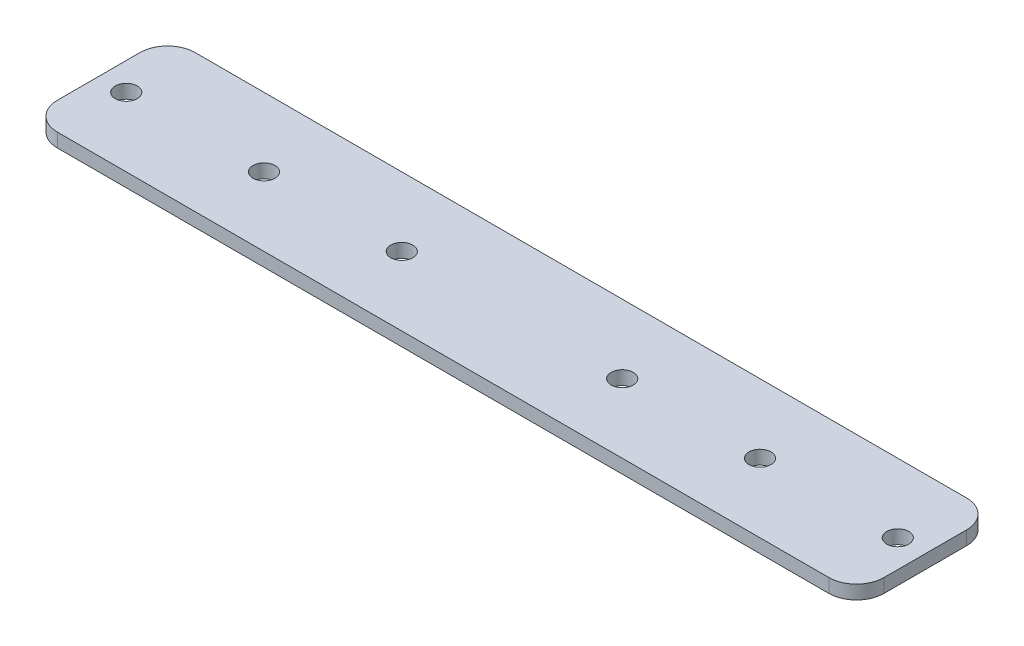
ISO-10303-21;
HEADER;
FILE_DESCRIPTION(('STEP AP214'),'2;1');
FILE_NAME('part.step','',(''),(''),'','','');
FILE_SCHEMA(('AUTOMOTIVE_DESIGN { 1 0 10303 214 1 1 1 1 }'));
ENDSEC;
DATA;
#1=APPLICATION_CONTEXT('core data for automotive mechanical design processes');
#2=APPLICATION_PROTOCOL_DEFINITION('international standard','automotive_design',2000,#1);
#3=PRODUCT_CONTEXT('',#1,'mechanical');
#4=PRODUCT('Part','Part','',(#3));
#5=PRODUCT_RELATED_PRODUCT_CATEGORY('part','',(#4));
#6=PRODUCT_DEFINITION_FORMATION('','',#4);
#7=PRODUCT_DEFINITION_CONTEXT('part definition',#1,'design');
#8=PRODUCT_DEFINITION('design','',#6,#7);
#9=PRODUCT_DEFINITION_SHAPE('','',#8);
#10=(LENGTH_UNIT() NAMED_UNIT(*) SI_UNIT(.MILLI.,.METRE.));
#11=(NAMED_UNIT(*) PLANE_ANGLE_UNIT() SI_UNIT($,.RADIAN.));
#12=(NAMED_UNIT(*) SI_UNIT($,.STERADIAN.) SOLID_ANGLE_UNIT());
#13=UNCERTAINTY_MEASURE_WITH_UNIT(LENGTH_MEASURE(1.E-05),#10,'distance_accuracy_value','');
#14=(GEOMETRIC_REPRESENTATION_CONTEXT(3) GLOBAL_UNCERTAINTY_ASSIGNED_CONTEXT((#13)) GLOBAL_UNIT_ASSIGNED_CONTEXT((#10,
#11,#12)) REPRESENTATION_CONTEXT('',''));
#15=CARTESIAN_POINT('',(0.,0.,0.));
#16=DIRECTION('',(0.,0.,1.));
#17=DIRECTION('',(1.,0.,0.));
#18=AXIS2_PLACEMENT_3D('',#15,#16,#17);
#19=CARTESIAN_POINT('',(0.,2.,0.));
#20=DIRECTION('',(0.,-1.,0.));
#21=DIRECTION('',(0.,0.,-1.));
#22=AXIS2_PLACEMENT_3D('',#19,#20,#21);
#23=PLANE('',#22);
#24=DIRECTION('',(-1.,0.,0.));
#25=VECTOR('',#24,1.);
#26=CARTESIAN_POINT('',(-60.,2.,-10.));
#27=LINE('',#26,#25);
#28=CARTESIAN_POINT('',(56.,2.,-10.));
#29=VERTEX_POINT('',#28);
#30=CARTESIAN_POINT('',(-56.,2.,-10.));
#31=VERTEX_POINT('',#30);
#32=EDGE_CURVE('E172',#29,#31,#27,.T.);
#33=ORIENTED_EDGE('',*,*,#32,.T.);
#34=CARTESIAN_POINT('',(-56.,2.,-6.));
#35=DIRECTION('',(0.,-1.,0.));
#36=DIRECTION('',(0.,0.,-1.));
#37=AXIS2_PLACEMENT_3D('',#34,#35,#36);
#38=CIRCLE('',#37,4.);
#39=CARTESIAN_POINT('',(-60.,2.,-6.));
#40=VERTEX_POINT('',#39);
#41=EDGE_CURVE('E153',#31,#40,#38,.F.);
#42=ORIENTED_EDGE('',*,*,#41,.T.);
#43=DIRECTION('',(0.,0.,1.));
#44=VECTOR('',#43,1.);
#45=CARTESIAN_POINT('',(-60.,2.,10.));
#46=LINE('',#45,#44);
#47=CARTESIAN_POINT('',(-60.,2.,6.));
#48=VERTEX_POINT('',#47);
#49=EDGE_CURVE('E123',#40,#48,#46,.T.);
#50=ORIENTED_EDGE('',*,*,#49,.T.);
#51=CARTESIAN_POINT('',(-56.,2.,6.));
#52=DIRECTION('',(0.,-1.,0.));
#53=DIRECTION('',(0.,0.,-1.));
#54=AXIS2_PLACEMENT_3D('',#51,#52,#53);
#55=CIRCLE('',#54,4.);
#56=CARTESIAN_POINT('',(-56.,2.,10.));
#57=VERTEX_POINT('',#56);
#58=EDGE_CURVE('E59',#48,#57,#55,.F.);
#59=ORIENTED_EDGE('',*,*,#58,.T.);
#60=DIRECTION('',(1.,0.,0.));
#61=VECTOR('',#60,1.);
#62=CARTESIAN_POINT('',(-60.,2.,10.));
#63=LINE('',#62,#61);
#64=CARTESIAN_POINT('',(56.,2.,10.));
#65=VERTEX_POINT('',#64);
#66=EDGE_CURVE('E139',#57,#65,#63,.T.);
#67=ORIENTED_EDGE('',*,*,#66,.T.);
#68=CARTESIAN_POINT('',(56.,2.,6.));
#69=DIRECTION('',(0.,-1.,0.));
#70=DIRECTION('',(0.,0.,-1.));
#71=AXIS2_PLACEMENT_3D('',#68,#69,#70);
#72=CIRCLE('',#71,4.);
#73=CARTESIAN_POINT('',(60.,2.,6.));
#74=VERTEX_POINT('',#73);
#75=EDGE_CURVE('E150',#65,#74,#72,.F.);
#76=ORIENTED_EDGE('',*,*,#75,.T.);
#77=DIRECTION('',(0.,0.,-1.));
#78=VECTOR('',#77,1.);
#79=CARTESIAN_POINT('',(60.,2.,10.));
#80=LINE('',#79,#78);
#81=CARTESIAN_POINT('',(60.,2.,-6.));
#82=VERTEX_POINT('',#81);
#83=EDGE_CURVE('E133',#74,#82,#80,.T.);
#84=ORIENTED_EDGE('',*,*,#83,.T.);
#85=CARTESIAN_POINT('',(56.,2.,-6.));
#86=DIRECTION('',(0.,-1.,0.));
#87=DIRECTION('',(0.,0.,-1.));
#88=AXIS2_PLACEMENT_3D('',#85,#86,#87);
#89=CIRCLE('',#88,4.);
#90=EDGE_CURVE('E148',#82,#29,#89,.F.);
#91=ORIENTED_EDGE('',*,*,#90,.T.);
#92=EDGE_LOOP('',(#33,#42,#50,#59,#67,#76,#84,#91));
#93=FACE_BOUND('',#92,.T.);
#94=CARTESIAN_POINT('',(16.,2.,0.));
#95=DIRECTION('',(0.,1.,0.));
#96=DIRECTION('',(0.,0.,1.));
#97=AXIS2_PLACEMENT_3D('',#94,#95,#96);
#98=CIRCLE('',#97,1.6);
#99=CARTESIAN_POINT('',(16.,2.,1.6));
#100=VERTEX_POINT('',#99);
#101=EDGE_CURVE('E177',#100,#100,#98,.T.);
#102=ORIENTED_EDGE('',*,*,#101,.F.);
#103=EDGE_LOOP('',(#102));
#104=FACE_BOUND('',#103,.T.);
#105=CARTESIAN_POINT('',(-16.,2.,0.));
#106=DIRECTION('',(0.,1.,0.));
#107=DIRECTION('',(0.,0.,1.));
#108=AXIS2_PLACEMENT_3D('',#105,#106,#107);
#109=CIRCLE('',#108,1.6);
#110=CARTESIAN_POINT('',(-16.,2.,1.6));
#111=VERTEX_POINT('',#110);
#112=EDGE_CURVE('E186',#111,#111,#109,.T.);
#113=ORIENTED_EDGE('',*,*,#112,.F.);
#114=EDGE_LOOP('',(#113));
#115=FACE_BOUND('',#114,.T.);
#116=CARTESIAN_POINT('',(36.,2.,0.));
#117=DIRECTION('',(0.,1.,0.));
#118=DIRECTION('',(0.,0.,1.));
#119=AXIS2_PLACEMENT_3D('',#116,#117,#118);
#120=CIRCLE('',#119,1.6);
#121=CARTESIAN_POINT('',(36.,2.,1.6));
#122=VERTEX_POINT('',#121);
#123=EDGE_CURVE('E191',#122,#122,#120,.T.);
#124=ORIENTED_EDGE('',*,*,#123,.F.);
#125=EDGE_LOOP('',(#124));
#126=FACE_BOUND('',#125,.T.);
#127=CARTESIAN_POINT('',(56.,2.,0.));
#128=DIRECTION('',(0.,1.,0.));
#129=DIRECTION('',(0.,0.,1.));
#130=AXIS2_PLACEMENT_3D('',#127,#128,#129);
#131=CIRCLE('',#130,1.60000000000001);
#132=CARTESIAN_POINT('',(56.,2.,1.60000000000001));
#133=VERTEX_POINT('',#132);
#134=EDGE_CURVE('E197',#133,#133,#131,.T.);
#135=ORIENTED_EDGE('',*,*,#134,.F.);
#136=EDGE_LOOP('',(#135));
#137=FACE_BOUND('',#136,.T.);
#138=CARTESIAN_POINT('',(-36.,2.,0.));
#139=DIRECTION('',(0.,1.,0.));
#140=DIRECTION('',(0.,0.,1.));
#141=AXIS2_PLACEMENT_3D('',#138,#139,#140);
#142=CIRCLE('',#141,1.6);
#143=CARTESIAN_POINT('',(-36.,2.,1.6));
#144=VERTEX_POINT('',#143);
#145=EDGE_CURVE('E203',#144,#144,#142,.T.);
#146=ORIENTED_EDGE('',*,*,#145,.F.);
#147=EDGE_LOOP('',(#146));
#148=FACE_BOUND('',#147,.T.);
#149=CARTESIAN_POINT('',(-56.,2.,0.));
#150=DIRECTION('',(0.,1.,0.));
#151=DIRECTION('',(0.,0.,1.));
#152=AXIS2_PLACEMENT_3D('',#149,#150,#151);
#153=CIRCLE('',#152,1.60000000000001);
#154=CARTESIAN_POINT('',(-56.,2.,1.60000000000001));
#155=VERTEX_POINT('',#154);
#156=EDGE_CURVE('E209',#155,#155,#153,.T.);
#157=ORIENTED_EDGE('',*,*,#156,.F.);
#158=EDGE_LOOP('',(#157));
#159=FACE_BOUND('',#158,.T.);
#160=ADVANCED_FACE('F37',(#93,#104,#115,#126,#137,#148,#159),#23,.F.);
#161=CARTESIAN_POINT('',(0.,0.,0.));
#162=DIRECTION('',(0.,-1.,0.));
#163=DIRECTION('',(0.,0.,-1.));
#164=AXIS2_PLACEMENT_3D('',#161,#162,#163);
#165=PLANE('',#164);
#166=CARTESIAN_POINT('',(-36.,0.,0.));
#167=DIRECTION('',(0.,1.,0.));
#168=DIRECTION('',(0.,0.,1.));
#169=AXIS2_PLACEMENT_3D('',#166,#167,#168);
#170=CIRCLE('',#169,1.6);
#171=CARTESIAN_POINT('',(-36.,0.,1.6));
#172=VERTEX_POINT('',#171);
#173=EDGE_CURVE('E206',#172,#172,#170,.T.);
#174=ORIENTED_EDGE('',*,*,#173,.T.);
#175=EDGE_LOOP('',(#174));
#176=FACE_BOUND('',#175,.T.);
#177=CARTESIAN_POINT('',(36.,0.,0.));
#178=DIRECTION('',(0.,1.,0.));
#179=DIRECTION('',(0.,0.,1.));
#180=AXIS2_PLACEMENT_3D('',#177,#178,#179);
#181=CIRCLE('',#180,1.6);
#182=CARTESIAN_POINT('',(36.,0.,1.6));
#183=VERTEX_POINT('',#182);
#184=EDGE_CURVE('E194',#183,#183,#181,.T.);
#185=ORIENTED_EDGE('',*,*,#184,.T.);
#186=EDGE_LOOP('',(#185));
#187=FACE_BOUND('',#186,.T.);
#188=CARTESIAN_POINT('',(16.,0.,0.));
#189=DIRECTION('',(0.,1.,0.));
#190=DIRECTION('',(0.,0.,1.));
#191=AXIS2_PLACEMENT_3D('',#188,#189,#190);
#192=CIRCLE('',#191,1.6);
#193=CARTESIAN_POINT('',(16.,0.,1.6));
#194=VERTEX_POINT('',#193);
#195=EDGE_CURVE('E179',#194,#194,#192,.T.);
#196=ORIENTED_EDGE('',*,*,#195,.T.);
#197=EDGE_LOOP('',(#196));
#198=FACE_BOUND('',#197,.T.);
#199=DIRECTION('',(0.,0.,1.));
#200=VECTOR('',#199,1.);
#201=CARTESIAN_POINT('',(-60.,0.,10.));
#202=LINE('',#201,#200);
#203=CARTESIAN_POINT('',(-60.,0.,-6.));
#204=VERTEX_POINT('',#203);
#205=CARTESIAN_POINT('',(-60.,0.,6.));
#206=VERTEX_POINT('',#205);
#207=EDGE_CURVE('E121',#204,#206,#202,.T.);
#208=ORIENTED_EDGE('',*,*,#207,.F.);
#209=CARTESIAN_POINT('',(-56.,0.,-6.));
#210=DIRECTION('',(0.,-1.,0.));
#211=DIRECTION('',(0.,0.,-1.));
#212=AXIS2_PLACEMENT_3D('',#209,#210,#211);
#213=CIRCLE('',#212,4.);
#214=CARTESIAN_POINT('',(-56.,0.,-10.));
#215=VERTEX_POINT('',#214);
#216=EDGE_CURVE('E104',#204,#215,#213,.T.);
#217=ORIENTED_EDGE('',*,*,#216,.T.);
#218=DIRECTION('',(-1.,0.,0.));
#219=VECTOR('',#218,1.);
#220=CARTESIAN_POINT('',(-60.,0.,-10.));
#221=LINE('',#220,#219);
#222=CARTESIAN_POINT('',(56.,0.,-10.));
#223=VERTEX_POINT('',#222);
#224=EDGE_CURVE('E131',#223,#215,#221,.T.);
#225=ORIENTED_EDGE('',*,*,#224,.F.);
#226=CARTESIAN_POINT('',(56.,0.,-6.));
#227=DIRECTION('',(0.,-1.,0.));
#228=DIRECTION('',(0.,0.,-1.));
#229=AXIS2_PLACEMENT_3D('',#226,#227,#228);
#230=CIRCLE('',#229,4.);
#231=CARTESIAN_POINT('',(60.,0.,-6.));
#232=VERTEX_POINT('',#231);
#233=EDGE_CURVE('E124',#223,#232,#230,.T.);
#234=ORIENTED_EDGE('',*,*,#233,.T.);
#235=DIRECTION('',(0.,0.,-1.));
#236=VECTOR('',#235,1.);
#237=CARTESIAN_POINT('',(60.,0.,10.));
#238=LINE('',#237,#236);
#239=CARTESIAN_POINT('',(60.,0.,6.));
#240=VERTEX_POINT('',#239);
#241=EDGE_CURVE('E135',#240,#232,#238,.T.);
#242=ORIENTED_EDGE('',*,*,#241,.F.);
#243=CARTESIAN_POINT('',(56.,0.,6.));
#244=DIRECTION('',(0.,-1.,0.));
#245=DIRECTION('',(0.,0.,-1.));
#246=AXIS2_PLACEMENT_3D('',#243,#244,#245);
#247=CIRCLE('',#246,4.);
#248=CARTESIAN_POINT('',(56.,0.,10.));
#249=VERTEX_POINT('',#248);
#250=EDGE_CURVE('E142',#240,#249,#247,.T.);
#251=ORIENTED_EDGE('',*,*,#250,.T.);
#252=DIRECTION('',(1.,0.,0.));
#253=VECTOR('',#252,1.);
#254=CARTESIAN_POINT('',(-60.,0.,10.));
#255=LINE('',#254,#253);
#256=CARTESIAN_POINT('',(-56.,0.,10.));
#257=VERTEX_POINT('',#256);
#258=EDGE_CURVE('E130',#257,#249,#255,.T.);
#259=ORIENTED_EDGE('',*,*,#258,.F.);
#260=CARTESIAN_POINT('',(-56.,0.,6.));
#261=DIRECTION('',(0.,-1.,0.));
#262=DIRECTION('',(0.,0.,-1.));
#263=AXIS2_PLACEMENT_3D('',#260,#261,#262);
#264=CIRCLE('',#263,4.);
#265=EDGE_CURVE('E115',#257,#206,#264,.T.);
#266=ORIENTED_EDGE('',*,*,#265,.T.);
#267=EDGE_LOOP('',(#208,#217,#225,#234,#242,#251,#259,#266));
#268=FACE_BOUND('',#267,.T.);
#269=CARTESIAN_POINT('',(-16.,0.,0.));
#270=DIRECTION('',(0.,1.,0.));
#271=DIRECTION('',(0.,0.,1.));
#272=AXIS2_PLACEMENT_3D('',#269,#270,#271);
#273=CIRCLE('',#272,1.6);
#274=CARTESIAN_POINT('',(-16.,0.,1.6));
#275=VERTEX_POINT('',#274);
#276=EDGE_CURVE('E188',#275,#275,#273,.T.);
#277=ORIENTED_EDGE('',*,*,#276,.T.);
#278=EDGE_LOOP('',(#277));
#279=FACE_BOUND('',#278,.T.);
#280=CARTESIAN_POINT('',(56.,0.,0.));
#281=DIRECTION('',(0.,1.,0.));
#282=DIRECTION('',(0.,0.,1.));
#283=AXIS2_PLACEMENT_3D('',#280,#281,#282);
#284=CIRCLE('',#283,1.60000000000001);
#285=CARTESIAN_POINT('',(56.,0.,1.60000000000001));
#286=VERTEX_POINT('',#285);
#287=EDGE_CURVE('E200',#286,#286,#284,.T.);
#288=ORIENTED_EDGE('',*,*,#287,.T.);
#289=EDGE_LOOP('',(#288));
#290=FACE_BOUND('',#289,.T.);
#291=CARTESIAN_POINT('',(-56.,0.,0.));
#292=DIRECTION('',(0.,1.,0.));
#293=DIRECTION('',(0.,0.,1.));
#294=AXIS2_PLACEMENT_3D('',#291,#292,#293);
#295=CIRCLE('',#294,1.60000000000001);
#296=CARTESIAN_POINT('',(-56.,0.,1.60000000000001));
#297=VERTEX_POINT('',#296);
#298=EDGE_CURVE('E212',#297,#297,#295,.T.);
#299=ORIENTED_EDGE('',*,*,#298,.T.);
#300=EDGE_LOOP('',(#299));
#301=FACE_BOUND('',#300,.T.);
#302=ADVANCED_FACE('F127',(#176,#187,#198,#268,#279,#290,#301),#165,.T.);
#303=CARTESIAN_POINT('',(60.,2.,10.));
#304=DIRECTION('',(-1.,0.,0.));
#305=DIRECTION('',(0.,0.,1.));
#306=AXIS2_PLACEMENT_3D('',#303,#304,#305);
#307=PLANE('',#306);
#308=ORIENTED_EDGE('',*,*,#83,.F.);
#309=DIRECTION('',(0.,-1.,0.));
#310=VECTOR('',#309,1.);
#311=CARTESIAN_POINT('',(60.,2.,6.));
#312=LINE('',#311,#310);
#313=EDGE_CURVE('E11',#74,#240,#312,.T.);
#314=ORIENTED_EDGE('',*,*,#313,.T.);
#315=ORIENTED_EDGE('',*,*,#241,.T.);
#316=DIRECTION('',(0.,-1.,0.));
#317=VECTOR('',#316,1.);
#318=CARTESIAN_POINT('',(60.,2.,-6.));
#319=LINE('',#318,#317);
#320=EDGE_CURVE('E45',#232,#82,#319,.F.);
#321=ORIENTED_EDGE('',*,*,#320,.T.);
#322=EDGE_LOOP('',(#308,#314,#315,#321));
#323=FACE_BOUND('',#322,.T.);
#324=ADVANCED_FACE('F163',(#323),#307,.F.);
#325=CARTESIAN_POINT('',(-60.,2.,-10.));
#326=DIRECTION('',(0.,0.,1.));
#327=DIRECTION('',(1.,0.,0.));
#328=AXIS2_PLACEMENT_3D('',#325,#326,#327);
#329=PLANE('',#328);
#330=ORIENTED_EDGE('',*,*,#224,.T.);
#331=DIRECTION('',(0.,-1.,0.));
#332=VECTOR('',#331,1.);
#333=CARTESIAN_POINT('',(-56.,2.,-10.));
#334=LINE('',#333,#332);
#335=EDGE_CURVE('E109',#215,#31,#334,.F.);
#336=ORIENTED_EDGE('',*,*,#335,.T.);
#337=ORIENTED_EDGE('',*,*,#32,.F.);
#338=DIRECTION('',(0.,-1.,0.));
#339=VECTOR('',#338,1.);
#340=CARTESIAN_POINT('',(56.,2.,-10.));
#341=LINE('',#340,#339);
#342=EDGE_CURVE('E114',#29,#223,#341,.T.);
#343=ORIENTED_EDGE('',*,*,#342,.T.);
#344=EDGE_LOOP('',(#330,#336,#337,#343));
#345=FACE_BOUND('',#344,.T.);
#346=ADVANCED_FACE('F176',(#345),#329,.F.);
#347=CARTESIAN_POINT('',(-60.,2.,10.));
#348=DIRECTION('',(1.,0.,0.));
#349=DIRECTION('',(0.,0.,-1.));
#350=AXIS2_PLACEMENT_3D('',#347,#348,#349);
#351=PLANE('',#350);
#352=ORIENTED_EDGE('',*,*,#49,.F.);
#353=DIRECTION('',(0.,-1.,0.));
#354=VECTOR('',#353,1.);
#355=CARTESIAN_POINT('',(-60.,2.,-6.));
#356=LINE('',#355,#354);
#357=EDGE_CURVE('E108',#40,#204,#356,.T.);
#358=ORIENTED_EDGE('',*,*,#357,.T.);
#359=ORIENTED_EDGE('',*,*,#207,.T.);
#360=DIRECTION('',(0.,-1.,0.));
#361=VECTOR('',#360,1.);
#362=CARTESIAN_POINT('',(-60.,2.,6.));
#363=LINE('',#362,#361);
#364=EDGE_CURVE('E125',#206,#48,#363,.F.);
#365=ORIENTED_EDGE('',*,*,#364,.T.);
#366=EDGE_LOOP('',(#352,#358,#359,#365));
#367=FACE_BOUND('',#366,.T.);
#368=ADVANCED_FACE('F120',(#367),#351,.F.);
#369=CARTESIAN_POINT('',(-60.,2.,10.));
#370=DIRECTION('',(0.,0.,-1.));
#371=DIRECTION('',(-1.,0.,0.));
#372=AXIS2_PLACEMENT_3D('',#369,#370,#371);
#373=PLANE('',#372);
#374=ORIENTED_EDGE('',*,*,#66,.F.);
#375=DIRECTION('',(0.,-1.,0.));
#376=VECTOR('',#375,1.);
#377=CARTESIAN_POINT('',(-56.,2.,10.));
#378=LINE('',#377,#376);
#379=EDGE_CURVE('E156',#57,#257,#378,.T.);
#380=ORIENTED_EDGE('',*,*,#379,.T.);
#381=ORIENTED_EDGE('',*,*,#258,.T.);
#382=DIRECTION('',(0.,-1.,0.));
#383=VECTOR('',#382,1.);
#384=CARTESIAN_POINT('',(56.,2.,10.));
#385=LINE('',#384,#383);
#386=EDGE_CURVE('E52',#249,#65,#385,.F.);
#387=ORIENTED_EDGE('',*,*,#386,.T.);
#388=EDGE_LOOP('',(#374,#380,#381,#387));
#389=FACE_BOUND('',#388,.T.);
#390=ADVANCED_FACE('F232',(#389),#373,.F.);
#391=CARTESIAN_POINT('',(16.,2.,0.));
#392=DIRECTION('',(0.,-1.,0.));
#393=DIRECTION('',(0.,0.,-1.));
#394=AXIS2_PLACEMENT_3D('',#391,#392,#393);
#395=CYLINDRICAL_SURFACE('',#394,1.6);
#396=ORIENTED_EDGE('',*,*,#101,.T.);
#397=EDGE_LOOP('',(#396));
#398=FACE_BOUND('',#397,.T.);
#399=ORIENTED_EDGE('',*,*,#195,.F.);
#400=EDGE_LOOP('',(#399));
#401=FACE_BOUND('',#400,.T.);
#402=ADVANCED_FACE('F229',(#398,#401),#395,.F.);
#403=CARTESIAN_POINT('',(-16.,2.,0.));
#404=DIRECTION('',(0.,-1.,0.));
#405=DIRECTION('',(0.,0.,-1.));
#406=AXIS2_PLACEMENT_3D('',#403,#404,#405);
#407=CYLINDRICAL_SURFACE('',#406,1.6);
#408=ORIENTED_EDGE('',*,*,#112,.T.);
#409=EDGE_LOOP('',(#408));
#410=FACE_BOUND('',#409,.T.);
#411=ORIENTED_EDGE('',*,*,#276,.F.);
#412=EDGE_LOOP('',(#411));
#413=FACE_BOUND('',#412,.T.);
#414=ADVANCED_FACE('F344',(#410,#413),#407,.F.);
#415=CARTESIAN_POINT('',(36.,2.,0.));
#416=DIRECTION('',(0.,-1.,0.));
#417=DIRECTION('',(0.,0.,-1.));
#418=AXIS2_PLACEMENT_3D('',#415,#416,#417);
#419=CYLINDRICAL_SURFACE('',#418,1.6);
#420=ORIENTED_EDGE('',*,*,#123,.T.);
#421=EDGE_LOOP('',(#420));
#422=FACE_BOUND('',#421,.T.);
#423=ORIENTED_EDGE('',*,*,#184,.F.);
#424=EDGE_LOOP('',(#423));
#425=FACE_BOUND('',#424,.T.);
#426=ADVANCED_FACE('F334',(#422,#425),#419,.F.);
#427=CARTESIAN_POINT('',(56.,2.,0.));
#428=DIRECTION('',(0.,-1.,0.));
#429=DIRECTION('',(0.,0.,-1.));
#430=AXIS2_PLACEMENT_3D('',#427,#428,#429);
#431=CYLINDRICAL_SURFACE('',#430,1.60000000000001);
#432=ORIENTED_EDGE('',*,*,#134,.T.);
#433=EDGE_LOOP('',(#432));
#434=FACE_BOUND('',#433,.T.);
#435=ORIENTED_EDGE('',*,*,#287,.F.);
#436=EDGE_LOOP('',(#435));
#437=FACE_BOUND('',#436,.T.);
#438=ADVANCED_FACE('F324',(#434,#437),#431,.F.);
#439=CARTESIAN_POINT('',(-36.,2.,0.));
#440=DIRECTION('',(0.,-1.,0.));
#441=DIRECTION('',(0.,0.,-1.));
#442=AXIS2_PLACEMENT_3D('',#439,#440,#441);
#443=CYLINDRICAL_SURFACE('',#442,1.6);
#444=ORIENTED_EDGE('',*,*,#145,.T.);
#445=EDGE_LOOP('',(#444));
#446=FACE_BOUND('',#445,.T.);
#447=ORIENTED_EDGE('',*,*,#173,.F.);
#448=EDGE_LOOP('',(#447));
#449=FACE_BOUND('',#448,.T.);
#450=ADVANCED_FACE('F315',(#446,#449),#443,.F.);
#451=CARTESIAN_POINT('',(-56.,2.,0.));
#452=DIRECTION('',(0.,-1.,0.));
#453=DIRECTION('',(0.,0.,-1.));
#454=AXIS2_PLACEMENT_3D('',#451,#452,#453);
#455=CYLINDRICAL_SURFACE('',#454,1.60000000000001);
#456=ORIENTED_EDGE('',*,*,#156,.T.);
#457=EDGE_LOOP('',(#456));
#458=FACE_BOUND('',#457,.T.);
#459=ORIENTED_EDGE('',*,*,#298,.F.);
#460=EDGE_LOOP('',(#459));
#461=FACE_BOUND('',#460,.T.);
#462=ADVANCED_FACE('F218',(#458,#461),#455,.F.);
#463=CARTESIAN_POINT('',(-56.,2.,-6.));
#464=DIRECTION('',(0.,-1.,0.));
#465=DIRECTION('',(0.,0.,-1.));
#466=AXIS2_PLACEMENT_3D('',#463,#464,#465);
#467=CYLINDRICAL_SURFACE('',#466,4.);
#468=ORIENTED_EDGE('',*,*,#41,.F.);
#469=ORIENTED_EDGE('',*,*,#335,.F.);
#470=ORIENTED_EDGE('',*,*,#216,.F.);
#471=ORIENTED_EDGE('',*,*,#357,.F.);
#472=EDGE_LOOP('',(#468,#469,#470,#471));
#473=FACE_BOUND('',#472,.T.);
#474=ADVANCED_FACE('F107',(#473),#467,.T.);
#475=CARTESIAN_POINT('',(-56.,2.,6.));
#476=DIRECTION('',(0.,-1.,0.));
#477=DIRECTION('',(0.,0.,-1.));
#478=AXIS2_PLACEMENT_3D('',#475,#476,#477);
#479=CYLINDRICAL_SURFACE('',#478,4.);
#480=ORIENTED_EDGE('',*,*,#58,.F.);
#481=ORIENTED_EDGE('',*,*,#364,.F.);
#482=ORIENTED_EDGE('',*,*,#265,.F.);
#483=ORIENTED_EDGE('',*,*,#379,.F.);
#484=EDGE_LOOP('',(#480,#481,#482,#483));
#485=FACE_BOUND('',#484,.T.);
#486=ADVANCED_FACE('F243',(#485),#479,.T.);
#487=CARTESIAN_POINT('',(56.,2.,6.));
#488=DIRECTION('',(0.,-1.,0.));
#489=DIRECTION('',(0.,0.,-1.));
#490=AXIS2_PLACEMENT_3D('',#487,#488,#489);
#491=CYLINDRICAL_SURFACE('',#490,4.);
#492=ORIENTED_EDGE('',*,*,#75,.F.);
#493=ORIENTED_EDGE('',*,*,#386,.F.);
#494=ORIENTED_EDGE('',*,*,#250,.F.);
#495=ORIENTED_EDGE('',*,*,#313,.F.);
#496=EDGE_LOOP('',(#492,#493,#494,#495));
#497=FACE_BOUND('',#496,.T.);
#498=ADVANCED_FACE('F245',(#497),#491,.T.);
#499=CARTESIAN_POINT('',(56.,2.,-6.));
#500=DIRECTION('',(0.,-1.,0.));
#501=DIRECTION('',(0.,0.,-1.));
#502=AXIS2_PLACEMENT_3D('',#499,#500,#501);
#503=CYLINDRICAL_SURFACE('',#502,4.);
#504=ORIENTED_EDGE('',*,*,#90,.F.);
#505=ORIENTED_EDGE('',*,*,#320,.F.);
#506=ORIENTED_EDGE('',*,*,#233,.F.);
#507=ORIENTED_EDGE('',*,*,#342,.F.);
#508=EDGE_LOOP('',(#504,#505,#506,#507));
#509=FACE_BOUND('',#508,.T.);
#510=ADVANCED_FACE('F39',(#509),#503,.T.);
#511=CLOSED_SHELL('',(#160,#302,#324,#346,#368,#390,#402,#414,#426,#438,#450,#462,#474,#486,
#498,#510));
#512=MANIFOLD_SOLID_BREP('B2',#511);
#513=ADVANCED_BREP_SHAPE_REPRESENTATION('',(#18,#512),#14);
#514=SHAPE_DEFINITION_REPRESENTATION(#9,#513);
ENDSEC;
END-ISO-10303-21;
